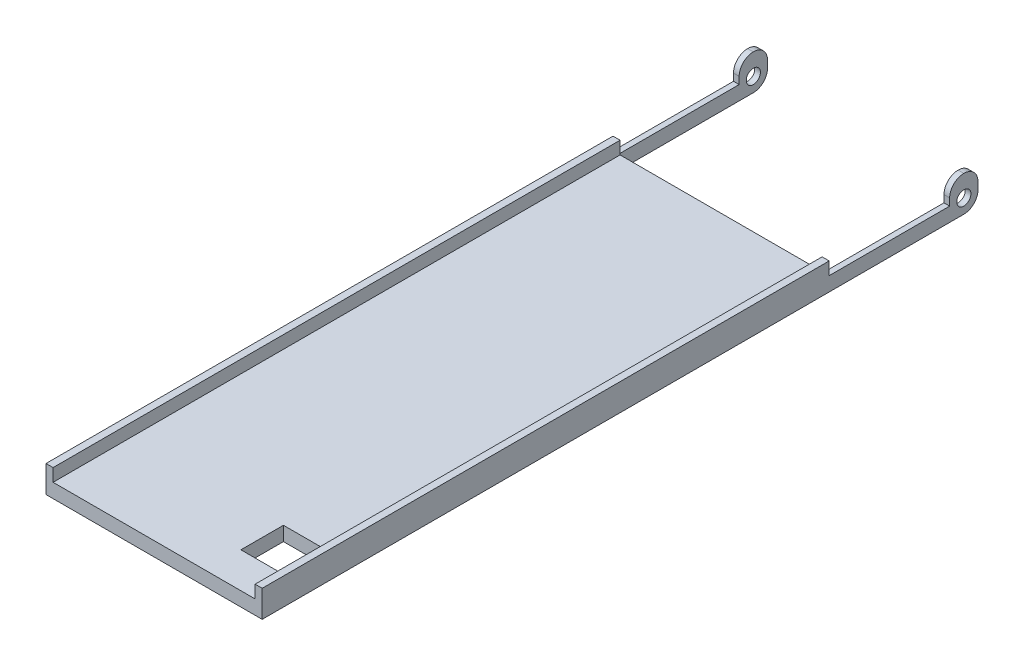
ISO-10303-21;
HEADER;
FILE_DESCRIPTION(('STEP AP214'),'2;1');
FILE_NAME('part.step','',(''),(''),'','','');
FILE_SCHEMA(('AUTOMOTIVE_DESIGN { 1 0 10303 214 1 1 1 1 }'));
ENDSEC;
DATA;
#1=APPLICATION_CONTEXT('core data for automotive mechanical design processes');
#2=APPLICATION_PROTOCOL_DEFINITION('international standard','automotive_design',2000,#1);
#3=PRODUCT_CONTEXT('',#1,'mechanical');
#4=PRODUCT('Part','Part','',(#3));
#5=PRODUCT_RELATED_PRODUCT_CATEGORY('part','',(#4));
#6=PRODUCT_DEFINITION_FORMATION('','',#4);
#7=PRODUCT_DEFINITION_CONTEXT('part definition',#1,'design');
#8=PRODUCT_DEFINITION('design','',#6,#7);
#9=PRODUCT_DEFINITION_SHAPE('','',#8);
#10=(LENGTH_UNIT() NAMED_UNIT(*) SI_UNIT(.MILLI.,.METRE.));
#11=(NAMED_UNIT(*) PLANE_ANGLE_UNIT() SI_UNIT($,.RADIAN.));
#12=(NAMED_UNIT(*) SI_UNIT($,.STERADIAN.) SOLID_ANGLE_UNIT());
#13=UNCERTAINTY_MEASURE_WITH_UNIT(LENGTH_MEASURE(1.E-05),#10,'distance_accuracy_value','');
#14=(GEOMETRIC_REPRESENTATION_CONTEXT(3) GLOBAL_UNCERTAINTY_ASSIGNED_CONTEXT((#13)) GLOBAL_UNIT_ASSIGNED_CONTEXT((#10,
#11,#12)) REPRESENTATION_CONTEXT('',''));
#15=CARTESIAN_POINT('',(0.,0.,0.));
#16=DIRECTION('',(0.,0.,1.));
#17=DIRECTION('',(1.,0.,0.));
#18=AXIS2_PLACEMENT_3D('',#15,#16,#17);
#19=CARTESIAN_POINT('',(0.,2.,0.));
#20=DIRECTION('',(0.,1.,0.));
#21=DIRECTION('',(0.,0.,1.));
#22=AXIS2_PLACEMENT_3D('',#19,#20,#21);
#23=PLANE('',#22);
#24=DIRECTION('',(0.,0.,-1.));
#25=VECTOR('',#24,1.);
#26=CARTESIAN_POINT('',(14.45,2.,-42.5));
#27=LINE('',#26,#25);
#28=CARTESIAN_POINT('',(14.45,2.,-21.5));
#29=VERTEX_POINT('',#28);
#30=CARTESIAN_POINT('',(14.45,2.,-38.5));
#31=VERTEX_POINT('',#30);
#32=EDGE_CURVE('E397',#29,#31,#27,.T.);
#33=ORIENTED_EDGE('',*,*,#32,.F.);
#34=DIRECTION('',(-1.,0.,0.));
#35=VECTOR('',#34,1.);
#36=CARTESIAN_POINT('',(15.25,2.,-21.5));
#37=LINE('',#36,#35);
#38=CARTESIAN_POINT('',(15.25,2.,-21.5));
#39=VERTEX_POINT('',#38);
#40=EDGE_CURVE('E322',#39,#29,#37,.T.);
#41=ORIENTED_EDGE('',*,*,#40,.F.);
#42=DIRECTION('',(0.,0.,-1.));
#43=VECTOR('',#42,1.);
#44=CARTESIAN_POINT('',(15.25,2.,42.5));
#45=LINE('',#44,#43);
#46=CARTESIAN_POINT('',(15.25,2.,-38.5));
#47=VERTEX_POINT('',#46);
#48=EDGE_CURVE('E420',#39,#47,#45,.T.);
#49=ORIENTED_EDGE('',*,*,#48,.T.);
#50=DIRECTION('',(1.,0.,0.));
#51=VECTOR('',#50,1.);
#52=CARTESIAN_POINT('',(14.45,2.,-38.5));
#53=LINE('',#52,#51);
#54=EDGE_CURVE('E362',#31,#47,#53,.T.);
#55=ORIENTED_EDGE('',*,*,#54,.F.);
#56=EDGE_LOOP('',(#33,#41,#49,#55));
#57=FACE_BOUND('',#56,.T.);
#58=ADVANCED_FACE('F45',(#57),#23,.T.);
#59=DIRECTION('',(1.,0.,0.));
#60=VECTOR('',#59,1.);
#61=CARTESIAN_POINT('',(14.25,2.,53.5));
#62=LINE('',#61,#60);
#63=CARTESIAN_POINT('',(7.25000000000001,2.,53.5));
#64=VERTEX_POINT('',#63);
#65=CARTESIAN_POINT('',(14.25,2.,53.5));
#66=VERTEX_POINT('',#65);
#67=EDGE_CURVE('E70',#64,#66,#62,.T.);
#68=ORIENTED_EDGE('',*,*,#67,.F.);
#69=DIRECTION('',(0.,0.,1.));
#70=VECTOR('',#69,1.);
#71=CARTESIAN_POINT('',(7.25000000000001,2.,47.5));
#72=LINE('',#71,#70);
#73=CARTESIAN_POINT('',(7.25000000000001,2.,47.5));
#74=VERTEX_POINT('',#73);
#75=EDGE_CURVE('E247',#74,#64,#72,.T.);
#76=ORIENTED_EDGE('',*,*,#75,.F.);
#77=DIRECTION('',(-1.,0.,0.));
#78=VECTOR('',#77,1.);
#79=CARTESIAN_POINT('',(14.25,2.,47.5));
#80=LINE('',#79,#78);
#81=CARTESIAN_POINT('',(14.25,2.,47.5));
#82=VERTEX_POINT('',#81);
#83=EDGE_CURVE('E254',#82,#74,#80,.T.);
#84=ORIENTED_EDGE('',*,*,#83,.F.);
#85=DIRECTION('',(0.,0.,-1.));
#86=VECTOR('',#85,1.);
#87=CARTESIAN_POINT('',(14.25,2.,-21.5));
#88=LINE('',#87,#86);
#89=CARTESIAN_POINT('',(14.25,2.,-21.5));
#90=VERTEX_POINT('',#89);
#91=EDGE_CURVE('E227',#82,#90,#88,.T.);
#92=ORIENTED_EDGE('',*,*,#91,.T.);
#93=DIRECTION('',(1.,0.,0.));
#94=VECTOR('',#93,1.);
#95=CARTESIAN_POINT('',(14.45,2.,-21.5));
#96=LINE('',#95,#94);
#97=CARTESIAN_POINT('',(-14.25,2.,-21.5));
#98=VERTEX_POINT('',#97);
#99=EDGE_CURVE('E280',#98,#90,#96,.T.);
#100=ORIENTED_EDGE('',*,*,#99,.F.);
#101=DIRECTION('',(0.,0.,1.));
#102=VECTOR('',#101,1.);
#103=CARTESIAN_POINT('',(-14.25,2.,-21.5));
#104=LINE('',#103,#102);
#105=CARTESIAN_POINT('',(-14.25,2.,58.5));
#106=VERTEX_POINT('',#105);
#107=EDGE_CURVE('E285',#98,#106,#104,.T.);
#108=ORIENTED_EDGE('',*,*,#107,.T.);
#109=DIRECTION('',(1.,0.,0.));
#110=VECTOR('',#109,1.);
#111=CARTESIAN_POINT('',(-14.25,2.,58.5));
#112=LINE('',#111,#110);
#113=CARTESIAN_POINT('',(14.25,2.,58.5));
#114=VERTEX_POINT('',#113);
#115=EDGE_CURVE('E289',#106,#114,#112,.T.);
#116=ORIENTED_EDGE('',*,*,#115,.T.);
#117=EDGE_CURVE('E294',#114,#66,#88,.T.);
#118=ORIENTED_EDGE('',*,*,#117,.T.);
#119=EDGE_LOOP('',(#68,#76,#84,#92,#100,#108,#116,#118));
#120=FACE_BOUND('',#119,.T.);
#121=ADVANCED_FACE('F591',(#120),#23,.T.);
#122=CARTESIAN_POINT('',(0.,3.8,0.));
#123=DIRECTION('',(0.,1.,0.));
#124=DIRECTION('',(0.,0.,1.));
#125=AXIS2_PLACEMENT_3D('',#122,#123,#124);
#126=PLANE('',#125);
#127=DIRECTION('',(0.,0.,1.));
#128=VECTOR('',#127,1.);
#129=CARTESIAN_POINT('',(-14.25,3.8,-21.5));
#130=LINE('',#129,#128);
#131=CARTESIAN_POINT('',(-14.25,3.8,-21.5));
#132=VERTEX_POINT('',#131);
#133=CARTESIAN_POINT('',(-14.25,3.8,58.5));
#134=VERTEX_POINT('',#133);
#135=EDGE_CURVE('E284',#132,#134,#130,.T.);
#136=ORIENTED_EDGE('',*,*,#135,.F.);
#137=DIRECTION('',(-1.,0.,0.));
#138=VECTOR('',#137,1.);
#139=CARTESIAN_POINT('',(15.25,3.8,-21.5));
#140=LINE('',#139,#138);
#141=CARTESIAN_POINT('',(-15.25,3.8,-21.5));
#142=VERTEX_POINT('',#141);
#143=EDGE_CURVE('E321',#132,#142,#140,.T.);
#144=ORIENTED_EDGE('',*,*,#143,.T.);
#145=DIRECTION('',(0.,0.,1.));
#146=VECTOR('',#145,1.);
#147=CARTESIAN_POINT('',(-15.25,3.8,58.5));
#148=LINE('',#147,#146);
#149=CARTESIAN_POINT('',(-15.25,3.8,58.5));
#150=VERTEX_POINT('',#149);
#151=EDGE_CURVE('E327',#142,#150,#148,.T.);
#152=ORIENTED_EDGE('',*,*,#151,.T.);
#153=DIRECTION('',(1.,0.,0.));
#154=VECTOR('',#153,1.);
#155=CARTESIAN_POINT('',(15.25,3.8,58.5));
#156=LINE('',#155,#154);
#157=EDGE_CURVE('E332',#150,#134,#156,.T.);
#158=ORIENTED_EDGE('',*,*,#157,.T.);
#159=EDGE_LOOP('',(#136,#144,#152,#158));
#160=FACE_BOUND('',#159,.T.);
#161=ADVANCED_FACE('F600',(#160),#126,.T.);
#162=CARTESIAN_POINT('',(-14.45,2.,-21.5));
#163=VERTEX_POINT('',#162);
#164=CARTESIAN_POINT('',(-15.25,2.,-21.5));
#165=VERTEX_POINT('',#164);
#166=EDGE_CURVE('E306',#163,#165,#37,.T.);
#167=ORIENTED_EDGE('',*,*,#166,.F.);
#168=DIRECTION('',(0.,0.,1.));
#169=VECTOR('',#168,1.);
#170=CARTESIAN_POINT('',(-14.45,2.,-24.5));
#171=LINE('',#170,#169);
#172=CARTESIAN_POINT('',(-14.45,2.,-38.5));
#173=VERTEX_POINT('',#172);
#174=EDGE_CURVE('E403',#173,#163,#171,.T.);
#175=ORIENTED_EDGE('',*,*,#174,.F.);
#176=DIRECTION('',(-1.,0.,0.));
#177=VECTOR('',#176,1.);
#178=CARTESIAN_POINT('',(-14.45,2.,-38.5));
#179=LINE('',#178,#177);
#180=CARTESIAN_POINT('',(-15.25,2.,-38.5));
#181=VERTEX_POINT('',#180);
#182=EDGE_CURVE('E383',#173,#181,#179,.T.);
#183=ORIENTED_EDGE('',*,*,#182,.T.);
#184=DIRECTION('',(0.,0.,-1.));
#185=VECTOR('',#184,1.);
#186=CARTESIAN_POINT('',(-15.25,2.,42.5));
#187=LINE('',#186,#185);
#188=EDGE_CURVE('E423',#165,#181,#187,.T.);
#189=ORIENTED_EDGE('',*,*,#188,.F.);
#190=EDGE_LOOP('',(#167,#175,#183,#189));
#191=FACE_BOUND('',#190,.T.);
#192=ADVANCED_FACE('F585',(#191),#23,.T.);
#193=CARTESIAN_POINT('',(-15.25,2.,-42.5));
#194=DIRECTION('',(0.,0.,-1.));
#195=DIRECTION('',(-1.,0.,0.));
#196=AXIS2_PLACEMENT_3D('',#193,#194,#195);
#197=PLANE('',#196);
#198=DIRECTION('',(0.,1.,0.));
#199=VECTOR('',#198,1.);
#200=CARTESIAN_POINT('',(-14.45,0.,-42.5));
#201=LINE('',#200,#199);
#202=CARTESIAN_POINT('',(-14.45,2.,-42.5));
#203=VERTEX_POINT('',#202);
#204=CARTESIAN_POINT('',(-14.45,3.,-42.5));
#205=VERTEX_POINT('',#204);
#206=EDGE_CURVE('E412',#203,#205,#201,.T.);
#207=ORIENTED_EDGE('',*,*,#206,.F.);
#208=DIRECTION('',(1.,0.,0.));
#209=VECTOR('',#208,1.);
#210=CARTESIAN_POINT('',(-15.25,2.,-42.5));
#211=LINE('',#210,#209);
#212=CARTESIAN_POINT('',(-15.25,2.,-42.5));
#213=VERTEX_POINT('',#212);
#214=EDGE_CURVE('E458',#203,#213,#211,.F.);
#215=ORIENTED_EDGE('',*,*,#214,.T.);
#216=DIRECTION('',(0.,-1.,0.));
#217=VECTOR('',#216,1.);
#218=CARTESIAN_POINT('',(-15.25,2.,-42.5));
#219=LINE('',#218,#217);
#220=CARTESIAN_POINT('',(-15.25,3.,-42.5));
#221=VERTEX_POINT('',#220);
#222=EDGE_CURVE('E427',#221,#213,#219,.T.);
#223=ORIENTED_EDGE('',*,*,#222,.F.);
#224=DIRECTION('',(-1.,0.,0.));
#225=VECTOR('',#224,1.);
#226=CARTESIAN_POINT('',(-15.25,3.,-42.5));
#227=LINE('',#226,#225);
#228=EDGE_CURVE('E454',#221,#205,#227,.F.);
#229=ORIENTED_EDGE('',*,*,#228,.T.);
#230=EDGE_LOOP('',(#207,#215,#223,#229));
#231=FACE_BOUND('',#230,.T.);
#232=ADVANCED_FACE('F562',(#231),#197,.T.);
#233=CARTESIAN_POINT('',(15.25,2.,42.5));
#234=DIRECTION('',(-1.,0.,0.));
#235=DIRECTION('',(0.,0.,1.));
#236=AXIS2_PLACEMENT_3D('',#233,#234,#235);
#237=PLANE('',#236);
#238=CARTESIAN_POINT('',(15.25,2.,-40.5));
#239=DIRECTION('',(-1.,0.,0.));
#240=DIRECTION('',(0.,0.,1.));
#241=AXIS2_PLACEMENT_3D('',#238,#239,#240);
#242=CIRCLE('',#241,0.999999999999998);
#243=CARTESIAN_POINT('',(15.25,2.,-39.5));
#244=VERTEX_POINT('',#243);
#245=EDGE_CURVE('E363',#244,#244,#242,.T.);
#246=ORIENTED_EDGE('',*,*,#245,.T.);
#247=EDGE_LOOP('',(#246));
#248=FACE_BOUND('',#247,.T.);
#249=DIRECTION('',(0.,0.,-1.));
#250=VECTOR('',#249,1.);
#251=CARTESIAN_POINT('',(15.25,0.,42.5));
#252=LINE('',#251,#250);
#253=CARTESIAN_POINT('',(15.25,0.,58.5));
#254=VERTEX_POINT('',#253);
#255=CARTESIAN_POINT('',(15.25,0.,-40.5));
#256=VERTEX_POINT('',#255);
#257=EDGE_CURVE('E416',#254,#256,#252,.T.);
#258=ORIENTED_EDGE('',*,*,#257,.T.);
#259=CARTESIAN_POINT('',(15.25,2.,-40.5));
#260=DIRECTION('',(-1.,0.,0.));
#261=DIRECTION('',(0.,0.,1.));
#262=AXIS2_PLACEMENT_3D('',#259,#260,#261);
#263=CIRCLE('',#262,2.);
#264=CARTESIAN_POINT('',(15.25,2.,-42.5));
#265=VERTEX_POINT('',#264);
#266=EDGE_CURVE('E486',#256,#265,#263,.F.);
#267=ORIENTED_EDGE('',*,*,#266,.T.);
#268=DIRECTION('',(0.,-1.,0.));
#269=VECTOR('',#268,1.);
#270=CARTESIAN_POINT('',(15.25,2.,-42.5));
#271=LINE('',#270,#269);
#272=CARTESIAN_POINT('',(15.25,3.,-42.5));
#273=VERTEX_POINT('',#272);
#274=EDGE_CURVE('E437',#273,#265,#271,.T.);
#275=ORIENTED_EDGE('',*,*,#274,.F.);
#276=CARTESIAN_POINT('',(15.25,3.,-40.5));
#277=DIRECTION('',(-1.,0.,0.));
#278=DIRECTION('',(0.,0.,1.));
#279=AXIS2_PLACEMENT_3D('',#276,#277,#278);
#280=CIRCLE('',#279,2.);
#281=CARTESIAN_POINT('',(15.25,5.,-40.5));
#282=VERTEX_POINT('',#281);
#283=EDGE_CURVE('E480',#273,#282,#280,.F.);
#284=ORIENTED_EDGE('',*,*,#283,.T.);
#285=CARTESIAN_POINT('',(15.25,3.,-40.5));
#286=DIRECTION('',(-1.,0.,0.));
#287=DIRECTION('',(0.,0.,1.));
#288=AXIS2_PLACEMENT_3D('',#285,#286,#287);
#289=CIRCLE('',#288,2.);
#290=CARTESIAN_POINT('',(15.25,3.,-38.5));
#291=VERTEX_POINT('',#290);
#292=EDGE_CURVE('E483',#282,#291,#289,.F.);
#293=ORIENTED_EDGE('',*,*,#292,.T.);
#294=DIRECTION('',(0.,-1.,0.));
#295=VECTOR('',#294,1.);
#296=CARTESIAN_POINT('',(15.25,5.,-38.5));
#297=LINE('',#296,#295);
#298=EDGE_CURVE('E371',#291,#47,#297,.T.);
#299=ORIENTED_EDGE('',*,*,#298,.T.);
#300=ORIENTED_EDGE('',*,*,#48,.F.);
#301=DIRECTION('',(0.,-1.,0.));
#302=VECTOR('',#301,1.);
#303=CARTESIAN_POINT('',(15.25,3.8,-21.5));
#304=LINE('',#303,#302);
#305=CARTESIAN_POINT('',(15.25,3.8,-21.5));
#306=VERTEX_POINT('',#305);
#307=EDGE_CURVE('E343',#306,#39,#304,.T.);
#308=ORIENTED_EDGE('',*,*,#307,.F.);
#309=DIRECTION('',(0.,0.,-1.));
#310=VECTOR('',#309,1.);
#311=CARTESIAN_POINT('',(15.25,3.8,58.5));
#312=LINE('',#311,#310);
#313=CARTESIAN_POINT('',(15.25,3.8,58.5));
#314=VERTEX_POINT('',#313);
#315=EDGE_CURVE('E317',#314,#306,#312,.T.);
#316=ORIENTED_EDGE('',*,*,#315,.F.);
#317=DIRECTION('',(0.,1.,0.));
#318=VECTOR('',#317,1.);
#319=CARTESIAN_POINT('',(15.25,2.,58.5));
#320=LINE('',#319,#318);
#321=EDGE_CURVE('E354',#254,#314,#320,.T.);
#322=ORIENTED_EDGE('',*,*,#321,.F.);
#323=EDGE_LOOP('',(#258,#267,#275,#284,#293,#299,#300,#308,#316,#322));
#324=FACE_BOUND('',#323,.T.);
#325=ADVANCED_FACE('F514',(#248,#324),#237,.F.);
#326=ORIENTED_EDGE('',*,*,#274,.T.);
#327=DIRECTION('',(1.,0.,0.));
#328=VECTOR('',#327,1.);
#329=CARTESIAN_POINT('',(14.45,2.,-42.5));
#330=LINE('',#329,#328);
#331=CARTESIAN_POINT('',(14.45,2.,-42.5));
#332=VERTEX_POINT('',#331);
#333=EDGE_CURVE('E492',#265,#332,#330,.F.);
#334=ORIENTED_EDGE('',*,*,#333,.T.);
#335=DIRECTION('',(0.,1.,0.));
#336=VECTOR('',#335,1.);
#337=CARTESIAN_POINT('',(14.45,0.,-42.5));
#338=LINE('',#337,#336);
#339=CARTESIAN_POINT('',(14.45,3.,-42.5));
#340=VERTEX_POINT('',#339);
#341=EDGE_CURVE('E406',#332,#340,#338,.T.);
#342=ORIENTED_EDGE('',*,*,#341,.T.);
#343=DIRECTION('',(1.,0.,0.));
#344=VECTOR('',#343,1.);
#345=CARTESIAN_POINT('',(-15.25,3.,-42.5));
#346=LINE('',#345,#344);
#347=EDGE_CURVE('E489',#340,#273,#346,.T.);
#348=ORIENTED_EDGE('',*,*,#347,.T.);
#349=EDGE_LOOP('',(#326,#334,#342,#348));
#350=FACE_BOUND('',#349,.T.);
#351=ADVANCED_FACE('F518',(#350),#197,.T.);
#352=CARTESIAN_POINT('',(-15.25,2.,42.5));
#353=DIRECTION('',(-1.,0.,0.));
#354=DIRECTION('',(0.,0.,1.));
#355=AXIS2_PLACEMENT_3D('',#352,#353,#354);
#356=PLANE('',#355);
#357=CARTESIAN_POINT('',(-15.25,2.,-40.5));
#358=DIRECTION('',(-1.,0.,0.));
#359=DIRECTION('',(0.,0.,1.));
#360=AXIS2_PLACEMENT_3D('',#357,#358,#359);
#361=CIRCLE('',#360,0.999999999999998);
#362=CARTESIAN_POINT('',(-15.25,2.,-39.5));
#363=VERTEX_POINT('',#362);
#364=EDGE_CURVE('E378',#363,#363,#361,.T.);
#365=ORIENTED_EDGE('',*,*,#364,.F.);
#366=EDGE_LOOP('',(#365));
#367=FACE_BOUND('',#366,.T.);
#368=ORIENTED_EDGE('',*,*,#222,.T.);
#369=CARTESIAN_POINT('',(-15.25,2.,-40.5));
#370=DIRECTION('',(-1.,0.,0.));
#371=DIRECTION('',(0.,0.,1.));
#372=AXIS2_PLACEMENT_3D('',#369,#370,#371);
#373=CIRCLE('',#372,2.);
#374=CARTESIAN_POINT('',(-15.25,0.,-40.5));
#375=VERTEX_POINT('',#374);
#376=EDGE_CURVE('E467',#213,#375,#373,.T.);
#377=ORIENTED_EDGE('',*,*,#376,.T.);
#378=DIRECTION('',(0.,0.,-1.));
#379=VECTOR('',#378,1.);
#380=CARTESIAN_POINT('',(-15.25,0.,42.5));
#381=LINE('',#380,#379);
#382=CARTESIAN_POINT('',(-15.25,0.,58.5));
#383=VERTEX_POINT('',#382);
#384=EDGE_CURVE('E424',#383,#375,#381,.T.);
#385=ORIENTED_EDGE('',*,*,#384,.F.);
#386=DIRECTION('',(0.,-1.,0.));
#387=VECTOR('',#386,1.);
#388=CARTESIAN_POINT('',(-15.25,2.,58.5));
#389=LINE('',#388,#387);
#390=EDGE_CURVE('E346',#150,#383,#389,.T.);
#391=ORIENTED_EDGE('',*,*,#390,.F.);
#392=ORIENTED_EDGE('',*,*,#151,.F.);
#393=DIRECTION('',(0.,-1.,0.));
#394=VECTOR('',#393,1.);
#395=CARTESIAN_POINT('',(-15.25,3.8,-21.5));
#396=LINE('',#395,#394);
#397=EDGE_CURVE('E336',#142,#165,#396,.T.);
#398=ORIENTED_EDGE('',*,*,#397,.T.);
#399=ORIENTED_EDGE('',*,*,#188,.T.);
#400=DIRECTION('',(0.,-1.,0.));
#401=VECTOR('',#400,1.);
#402=CARTESIAN_POINT('',(-15.25,5.,-38.5));
#403=LINE('',#402,#401);
#404=CARTESIAN_POINT('',(-15.25,3.,-38.5));
#405=VERTEX_POINT('',#404);
#406=EDGE_CURVE('E393',#405,#181,#403,.T.);
#407=ORIENTED_EDGE('',*,*,#406,.F.);
#408=CARTESIAN_POINT('',(-15.25,3.,-40.5));
#409=DIRECTION('',(-1.,0.,0.));
#410=DIRECTION('',(0.,0.,1.));
#411=AXIS2_PLACEMENT_3D('',#408,#409,#410);
#412=CIRCLE('',#411,2.);
#413=CARTESIAN_POINT('',(-15.25,5.,-40.5));
#414=VERTEX_POINT('',#413);
#415=EDGE_CURVE('E461',#405,#414,#412,.T.);
#416=ORIENTED_EDGE('',*,*,#415,.T.);
#417=CARTESIAN_POINT('',(-15.25,3.,-40.5));
#418=DIRECTION('',(-1.,0.,0.));
#419=DIRECTION('',(0.,0.,1.));
#420=AXIS2_PLACEMENT_3D('',#417,#418,#419);
#421=CIRCLE('',#420,2.);
#422=EDGE_CURVE('E464',#414,#221,#421,.T.);
#423=ORIENTED_EDGE('',*,*,#422,.T.);
#424=EDGE_LOOP('',(#368,#377,#385,#391,#392,#398,#399,#407,#416,#423));
#425=FACE_BOUND('',#424,.T.);
#426=ADVANCED_FACE('F579',(#367,#425),#356,.T.);
#427=CARTESIAN_POINT('',(0.,0.,0.));
#428=DIRECTION('',(0.,1.,0.));
#429=DIRECTION('',(0.,0.,1.));
#430=AXIS2_PLACEMENT_3D('',#427,#428,#429);
#431=PLANE('',#430);
#432=DIRECTION('',(1.,0.,0.));
#433=VECTOR('',#432,1.);
#434=CARTESIAN_POINT('',(14.25,0.,53.5));
#435=LINE('',#434,#433);
#436=CARTESIAN_POINT('',(7.25000000000001,0.,53.5));
#437=VERTEX_POINT('',#436);
#438=CARTESIAN_POINT('',(14.25,0.,53.5));
#439=VERTEX_POINT('',#438);
#440=EDGE_CURVE('E233',#437,#439,#435,.T.);
#441=ORIENTED_EDGE('',*,*,#440,.T.);
#442=DIRECTION('',(0.,0.,-1.));
#443=VECTOR('',#442,1.);
#444=CARTESIAN_POINT('',(14.25,0.,47.5));
#445=LINE('',#444,#443);
#446=CARTESIAN_POINT('',(14.25,0.,47.5));
#447=VERTEX_POINT('',#446);
#448=EDGE_CURVE('E224',#439,#447,#445,.T.);
#449=ORIENTED_EDGE('',*,*,#448,.T.);
#450=DIRECTION('',(-1.,0.,0.));
#451=VECTOR('',#450,1.);
#452=CARTESIAN_POINT('',(14.25,0.,47.5));
#453=LINE('',#452,#451);
#454=CARTESIAN_POINT('',(7.25000000000001,0.,47.5));
#455=VERTEX_POINT('',#454);
#456=EDGE_CURVE('E236',#447,#455,#453,.T.);
#457=ORIENTED_EDGE('',*,*,#456,.T.);
#458=DIRECTION('',(0.,0.,1.));
#459=VECTOR('',#458,1.);
#460=CARTESIAN_POINT('',(7.25000000000001,0.,47.5));
#461=LINE('',#460,#459);
#462=EDGE_CURVE('E62',#455,#437,#461,.T.);
#463=ORIENTED_EDGE('',*,*,#462,.T.);
#464=EDGE_LOOP('',(#441,#449,#457,#463));
#465=FACE_BOUND('',#464,.T.);
#466=DIRECTION('',(-1.,0.,0.));
#467=VECTOR('',#466,1.);
#468=CARTESIAN_POINT('',(14.45,0.,-21.5));
#469=LINE('',#468,#467);
#470=CARTESIAN_POINT('',(14.45,0.,-21.5));
#471=VERTEX_POINT('',#470);
#472=CARTESIAN_POINT('',(-14.45,0.,-21.5));
#473=VERTEX_POINT('',#472);
#474=EDGE_CURVE('E272',#471,#473,#469,.T.);
#475=ORIENTED_EDGE('',*,*,#474,.F.);
#476=DIRECTION('',(0.,0.,-1.));
#477=VECTOR('',#476,1.);
#478=CARTESIAN_POINT('',(14.45,0.,-24.5));
#479=LINE('',#478,#477);
#480=CARTESIAN_POINT('',(14.45,0.,-40.5));
#481=VERTEX_POINT('',#480);
#482=EDGE_CURVE('E398',#471,#481,#479,.T.);
#483=ORIENTED_EDGE('',*,*,#482,.T.);
#484=DIRECTION('',(1.,0.,0.));
#485=VECTOR('',#484,1.);
#486=CARTESIAN_POINT('',(15.25,0.,-40.5));
#487=LINE('',#486,#485);
#488=EDGE_CURVE('E473',#481,#256,#487,.T.);
#489=ORIENTED_EDGE('',*,*,#488,.T.);
#490=ORIENTED_EDGE('',*,*,#257,.F.);
#491=DIRECTION('',(1.,0.,0.));
#492=VECTOR('',#491,1.);
#493=CARTESIAN_POINT('',(-15.25,0.,58.5));
#494=LINE('',#493,#492);
#495=EDGE_CURVE('E350',#383,#254,#494,.T.);
#496=ORIENTED_EDGE('',*,*,#495,.F.);
#497=ORIENTED_EDGE('',*,*,#384,.T.);
#498=DIRECTION('',(1.,0.,0.));
#499=VECTOR('',#498,1.);
#500=CARTESIAN_POINT('',(-14.45,0.,-40.5));
#501=LINE('',#500,#499);
#502=CARTESIAN_POINT('',(-14.45,0.,-40.5));
#503=VERTEX_POINT('',#502);
#504=EDGE_CURVE('E441',#375,#503,#501,.T.);
#505=ORIENTED_EDGE('',*,*,#504,.T.);
#506=DIRECTION('',(0.,0.,1.));
#507=VECTOR('',#506,1.);
#508=CARTESIAN_POINT('',(-14.45,0.,-42.5));
#509=LINE('',#508,#507);
#510=EDGE_CURVE('E402',#503,#473,#509,.T.);
#511=ORIENTED_EDGE('',*,*,#510,.T.);
#512=EDGE_LOOP('',(#475,#483,#489,#490,#496,#497,#505,#511));
#513=FACE_BOUND('',#512,.T.);
#514=ADVANCED_FACE('F241',(#465,#513),#431,.F.);
#515=CARTESIAN_POINT('',(-14.45,0.,-24.5));
#516=DIRECTION('',(-1.,0.,0.));
#517=DIRECTION('',(0.,0.,1.));
#518=AXIS2_PLACEMENT_3D('',#515,#516,#517);
#519=PLANE('',#518);
#520=CARTESIAN_POINT('',(-14.45,2.,-40.5));
#521=DIRECTION('',(-1.,0.,0.));
#522=DIRECTION('',(0.,0.,1.));
#523=AXIS2_PLACEMENT_3D('',#520,#521,#522);
#524=CIRCLE('',#523,0.999999999999998);
#525=CARTESIAN_POINT('',(-14.45,2.,-39.5));
#526=VERTEX_POINT('',#525);
#527=EDGE_CURVE('E379',#526,#526,#524,.T.);
#528=ORIENTED_EDGE('',*,*,#527,.T.);
#529=EDGE_LOOP('',(#528));
#530=FACE_BOUND('',#529,.T.);
#531=ORIENTED_EDGE('',*,*,#510,.F.);
#532=CARTESIAN_POINT('',(-14.45,2.,-40.5));
#533=DIRECTION('',(-1.,0.,0.));
#534=DIRECTION('',(0.,0.,1.));
#535=AXIS2_PLACEMENT_3D('',#532,#533,#534);
#536=CIRCLE('',#535,2.);
#537=EDGE_CURVE('E451',#503,#203,#536,.F.);
#538=ORIENTED_EDGE('',*,*,#537,.T.);
#539=ORIENTED_EDGE('',*,*,#206,.T.);
#540=CARTESIAN_POINT('',(-14.45,3.,-40.5));
#541=DIRECTION('',(-1.,0.,0.));
#542=DIRECTION('',(0.,0.,1.));
#543=AXIS2_PLACEMENT_3D('',#540,#541,#542);
#544=CIRCLE('',#543,2.);
#545=CARTESIAN_POINT('',(-14.45,5.,-40.5));
#546=VERTEX_POINT('',#545);
#547=EDGE_CURVE('E448',#205,#546,#544,.F.);
#548=ORIENTED_EDGE('',*,*,#547,.T.);
#549=CARTESIAN_POINT('',(-14.45,3.,-40.5));
#550=DIRECTION('',(-1.,0.,0.));
#551=DIRECTION('',(0.,0.,1.));
#552=AXIS2_PLACEMENT_3D('',#549,#550,#551);
#553=CIRCLE('',#552,2.);
#554=CARTESIAN_POINT('',(-14.45,3.,-38.5));
#555=VERTEX_POINT('',#554);
#556=EDGE_CURVE('E445',#546,#555,#553,.F.);
#557=ORIENTED_EDGE('',*,*,#556,.T.);
#558=DIRECTION('',(0.,-1.,0.));
#559=VECTOR('',#558,1.);
#560=CARTESIAN_POINT('',(-14.45,5.,-38.5));
#561=LINE('',#560,#559);
#562=EDGE_CURVE('E390',#555,#173,#561,.T.);
#563=ORIENTED_EDGE('',*,*,#562,.T.);
#564=ORIENTED_EDGE('',*,*,#174,.T.);
#565=DIRECTION('',(0.,1.,0.));
#566=VECTOR('',#565,1.);
#567=CARTESIAN_POINT('',(-14.45,2.,-21.5));
#568=LINE('',#567,#566);
#569=EDGE_CURVE('E276',#473,#163,#568,.T.);
#570=ORIENTED_EDGE('',*,*,#569,.F.);
#571=EDGE_LOOP('',(#531,#538,#539,#548,#557,#563,#564,#570));
#572=FACE_BOUND('',#571,.T.);
#573=ADVANCED_FACE('F559',(#530,#572),#519,.F.);
#574=CARTESIAN_POINT('',(14.45,0.,-42.5));
#575=DIRECTION('',(1.,0.,0.));
#576=DIRECTION('',(0.,0.,-1.));
#577=AXIS2_PLACEMENT_3D('',#574,#575,#576);
#578=PLANE('',#577);
#579=CARTESIAN_POINT('',(14.45,2.,-40.5));
#580=DIRECTION('',(-1.,0.,0.));
#581=DIRECTION('',(0.,0.,1.));
#582=AXIS2_PLACEMENT_3D('',#579,#580,#581);
#583=CIRCLE('',#582,0.999999999999998);
#584=CARTESIAN_POINT('',(14.45,2.,-39.5));
#585=VERTEX_POINT('',#584);
#586=EDGE_CURVE('E358',#585,#585,#583,.T.);
#587=ORIENTED_EDGE('',*,*,#586,.F.);
#588=EDGE_LOOP('',(#587));
#589=FACE_BOUND('',#588,.T.);
#590=ORIENTED_EDGE('',*,*,#341,.F.);
#591=CARTESIAN_POINT('',(14.45,2.,-40.5));
#592=DIRECTION('',(1.,0.,0.));
#593=DIRECTION('',(0.,0.,-1.));
#594=AXIS2_PLACEMENT_3D('',#591,#592,#593);
#595=CIRCLE('',#594,2.);
#596=EDGE_CURVE('E55',#332,#481,#595,.F.);
#597=ORIENTED_EDGE('',*,*,#596,.T.);
#598=ORIENTED_EDGE('',*,*,#482,.F.);
#599=DIRECTION('',(0.,-1.,0.));
#600=VECTOR('',#599,1.);
#601=CARTESIAN_POINT('',(14.45,2.,-21.5));
#602=LINE('',#601,#600);
#603=EDGE_CURVE('E263',#29,#471,#602,.T.);
#604=ORIENTED_EDGE('',*,*,#603,.F.);
#605=ORIENTED_EDGE('',*,*,#32,.T.);
#606=DIRECTION('',(0.,-1.,0.));
#607=VECTOR('',#606,1.);
#608=CARTESIAN_POINT('',(14.45,5.,-38.5));
#609=LINE('',#608,#607);
#610=CARTESIAN_POINT('',(14.45,3.,-38.5));
#611=VERTEX_POINT('',#610);
#612=EDGE_CURVE('E375',#611,#31,#609,.T.);
#613=ORIENTED_EDGE('',*,*,#612,.F.);
#614=CARTESIAN_POINT('',(14.45,3.,-40.5));
#615=DIRECTION('',(1.,0.,0.));
#616=DIRECTION('',(0.,0.,-1.));
#617=AXIS2_PLACEMENT_3D('',#614,#615,#616);
#618=CIRCLE('',#617,2.);
#619=CARTESIAN_POINT('',(14.45,5.,-40.5));
#620=VERTEX_POINT('',#619);
#621=EDGE_CURVE('E498',#611,#620,#618,.F.);
#622=ORIENTED_EDGE('',*,*,#621,.T.);
#623=CARTESIAN_POINT('',(14.45,3.,-40.5));
#624=DIRECTION('',(1.,0.,0.));
#625=DIRECTION('',(0.,0.,-1.));
#626=AXIS2_PLACEMENT_3D('',#623,#624,#625);
#627=CIRCLE('',#626,2.);
#628=EDGE_CURVE('E495',#620,#340,#627,.F.);
#629=ORIENTED_EDGE('',*,*,#628,.T.);
#630=EDGE_LOOP('',(#590,#597,#598,#604,#605,#613,#622,#629));
#631=FACE_BOUND('',#630,.T.);
#632=ADVANCED_FACE('F505',(#589,#631),#578,.F.);
#633=CARTESIAN_POINT('',(-14.45,5.,-38.5));
#634=DIRECTION('',(0.,0.,1.));
#635=DIRECTION('',(1.,0.,0.));
#636=AXIS2_PLACEMENT_3D('',#633,#634,#635);
#637=PLANE('',#636);
#638=ORIENTED_EDGE('',*,*,#562,.F.);
#639=DIRECTION('',(-1.,0.,0.));
#640=VECTOR('',#639,1.);
#641=CARTESIAN_POINT('',(-14.45,3.,-38.5));
#642=LINE('',#641,#640);
#643=EDGE_CURVE('E470',#555,#405,#642,.T.);
#644=ORIENTED_EDGE('',*,*,#643,.T.);
#645=ORIENTED_EDGE('',*,*,#406,.T.);
#646=ORIENTED_EDGE('',*,*,#182,.F.);
#647=EDGE_LOOP('',(#638,#644,#645,#646));
#648=FACE_BOUND('',#647,.T.);
#649=ADVANCED_FACE('F577',(#648),#637,.T.);
#650=CARTESIAN_POINT('',(-14.45,2.,-40.5));
#651=DIRECTION('',(-1.,0.,0.));
#652=DIRECTION('',(0.,0.,1.));
#653=AXIS2_PLACEMENT_3D('',#650,#651,#652);
#654=CYLINDRICAL_SURFACE('',#653,0.999999999999998);
#655=ORIENTED_EDGE('',*,*,#527,.F.);
#656=EDGE_LOOP('',(#655));
#657=FACE_BOUND('',#656,.T.);
#658=ORIENTED_EDGE('',*,*,#364,.T.);
#659=EDGE_LOOP('',(#658));
#660=FACE_BOUND('',#659,.T.);
#661=ADVANCED_FACE('F657',(#657,#660),#654,.F.);
#662=CARTESIAN_POINT('',(14.45,5.,-38.5));
#663=DIRECTION('',(0.,0.,-1.));
#664=DIRECTION('',(-1.,0.,0.));
#665=AXIS2_PLACEMENT_3D('',#662,#663,#664);
#666=PLANE('',#665);
#667=ORIENTED_EDGE('',*,*,#298,.F.);
#668=DIRECTION('',(1.,0.,0.));
#669=VECTOR('',#668,1.);
#670=CARTESIAN_POINT('',(14.45,3.,-38.5));
#671=LINE('',#670,#669);
#672=EDGE_CURVE('E11',#291,#611,#671,.F.);
#673=ORIENTED_EDGE('',*,*,#672,.T.);
#674=ORIENTED_EDGE('',*,*,#612,.T.);
#675=ORIENTED_EDGE('',*,*,#54,.T.);
#676=EDGE_LOOP('',(#667,#673,#674,#675));
#677=FACE_BOUND('',#676,.T.);
#678=ADVANCED_FACE('F530',(#677),#666,.F.);
#679=CARTESIAN_POINT('',(14.45,2.,-40.5));
#680=DIRECTION('',(1.,0.,0.));
#681=DIRECTION('',(0.,0.,-1.));
#682=AXIS2_PLACEMENT_3D('',#679,#680,#681);
#683=CYLINDRICAL_SURFACE('',#682,0.999999999999998);
#684=ORIENTED_EDGE('',*,*,#586,.T.);
#685=EDGE_LOOP('',(#684));
#686=FACE_BOUND('',#685,.T.);
#687=ORIENTED_EDGE('',*,*,#245,.F.);
#688=EDGE_LOOP('',(#687));
#689=FACE_BOUND('',#688,.T.);
#690=ADVANCED_FACE('F632',(#686,#689),#683,.F.);
#691=CARTESIAN_POINT('',(0.,2.,-40.5));
#692=DIRECTION('',(-1.,0.,0.));
#693=DIRECTION('',(0.,0.,1.));
#694=AXIS2_PLACEMENT_3D('',#691,#692,#693);
#695=CYLINDRICAL_SURFACE('',#694,2.);
#696=ORIENTED_EDGE('',*,*,#376,.F.);
#697=ORIENTED_EDGE('',*,*,#214,.F.);
#698=ORIENTED_EDGE('',*,*,#537,.F.);
#699=ORIENTED_EDGE('',*,*,#504,.F.);
#700=EDGE_LOOP('',(#696,#697,#698,#699));
#701=FACE_BOUND('',#700,.T.);
#702=ADVANCED_FACE('F555',(#701),#695,.T.);
#703=CARTESIAN_POINT('',(-14.45,3.,-40.5));
#704=DIRECTION('',(-1.,0.,0.));
#705=DIRECTION('',(0.,0.,1.));
#706=AXIS2_PLACEMENT_3D('',#703,#704,#705);
#707=CYLINDRICAL_SURFACE('',#706,2.);
#708=ORIENTED_EDGE('',*,*,#643,.F.);
#709=ORIENTED_EDGE('',*,*,#556,.F.);
#710=DIRECTION('',(-1.,0.,0.));
#711=VECTOR('',#710,1.);
#712=CARTESIAN_POINT('',(3.51281503885302E-13,5.,-40.4999999999999));
#713=LINE('',#712,#711);
#714=EDGE_CURVE('E367',#414,#546,#713,.F.);
#715=ORIENTED_EDGE('',*,*,#714,.F.);
#716=ORIENTED_EDGE('',*,*,#415,.F.);
#717=EDGE_LOOP('',(#708,#709,#715,#716));
#718=FACE_BOUND('',#717,.T.);
#719=ADVANCED_FACE('F573',(#718),#707,.T.);
#720=CARTESIAN_POINT('',(0.,3.,-40.5));
#721=DIRECTION('',(-1.,0.,0.));
#722=DIRECTION('',(0.,0.,1.));
#723=AXIS2_PLACEMENT_3D('',#720,#721,#722);
#724=CYLINDRICAL_SURFACE('',#723,2.);
#725=ORIENTED_EDGE('',*,*,#547,.F.);
#726=ORIENTED_EDGE('',*,*,#228,.F.);
#727=ORIENTED_EDGE('',*,*,#422,.F.);
#728=ORIENTED_EDGE('',*,*,#714,.T.);
#729=EDGE_LOOP('',(#725,#726,#727,#728));
#730=FACE_BOUND('',#729,.T.);
#731=ADVANCED_FACE('F567',(#730),#724,.T.);
#732=CARTESIAN_POINT('',(0.,2.,-40.5));
#733=DIRECTION('',(-1.,0.,0.));
#734=DIRECTION('',(0.,0.,1.));
#735=AXIS2_PLACEMENT_3D('',#732,#733,#734);
#736=CYLINDRICAL_SURFACE('',#735,2.);
#737=ORIENTED_EDGE('',*,*,#596,.F.);
#738=ORIENTED_EDGE('',*,*,#333,.F.);
#739=ORIENTED_EDGE('',*,*,#266,.F.);
#740=ORIENTED_EDGE('',*,*,#488,.F.);
#741=EDGE_LOOP('',(#737,#738,#739,#740));
#742=FACE_BOUND('',#741,.T.);
#743=ADVANCED_FACE('F511',(#742),#736,.T.);
#744=CARTESIAN_POINT('',(-15.25,3.,-40.5));
#745=DIRECTION('',(1.,0.,0.));
#746=DIRECTION('',(0.,0.,-1.));
#747=AXIS2_PLACEMENT_3D('',#744,#745,#746);
#748=CYLINDRICAL_SURFACE('',#747,2.);
#749=ORIENTED_EDGE('',*,*,#347,.F.);
#750=ORIENTED_EDGE('',*,*,#628,.F.);
#751=DIRECTION('',(1.,0.,0.));
#752=VECTOR('',#751,1.);
#753=CARTESIAN_POINT('',(0.,5.,-40.5));
#754=LINE('',#753,#752);
#755=EDGE_CURVE('E49',#282,#620,#754,.F.);
#756=ORIENTED_EDGE('',*,*,#755,.F.);
#757=ORIENTED_EDGE('',*,*,#283,.F.);
#758=EDGE_LOOP('',(#749,#750,#756,#757));
#759=FACE_BOUND('',#758,.T.);
#760=ADVANCED_FACE('F47',(#759),#748,.T.);
#761=CARTESIAN_POINT('',(-3.51281503885302E-13,3.,-40.4999999999999));
#762=DIRECTION('',(-1.,0.,0.));
#763=DIRECTION('',(0.,0.,1.));
#764=AXIS2_PLACEMENT_3D('',#761,#762,#763);
#765=CYLINDRICAL_SURFACE('',#764,2.);
#766=ORIENTED_EDGE('',*,*,#621,.F.);
#767=ORIENTED_EDGE('',*,*,#672,.F.);
#768=ORIENTED_EDGE('',*,*,#292,.F.);
#769=ORIENTED_EDGE('',*,*,#755,.T.);
#770=EDGE_LOOP('',(#766,#767,#768,#769));
#771=FACE_BOUND('',#770,.T.);
#772=ADVANCED_FACE('F533',(#771),#765,.T.);
#773=CARTESIAN_POINT('',(0.,0.,58.5));
#774=DIRECTION('',(0.,0.,1.));
#775=DIRECTION('',(1.,0.,0.));
#776=AXIS2_PLACEMENT_3D('',#773,#774,#775);
#777=PLANE('',#776);
#778=DIRECTION('',(0.,1.,0.));
#779=VECTOR('',#778,1.);
#780=CARTESIAN_POINT('',(-14.25,2.,58.5));
#781=LINE('',#780,#779);
#782=EDGE_CURVE('E298',#106,#134,#781,.T.);
#783=ORIENTED_EDGE('',*,*,#782,.T.);
#784=ORIENTED_EDGE('',*,*,#157,.F.);
#785=ORIENTED_EDGE('',*,*,#390,.T.);
#786=ORIENTED_EDGE('',*,*,#495,.T.);
#787=ORIENTED_EDGE('',*,*,#321,.T.);
#788=CARTESIAN_POINT('',(14.25,3.8,58.5));
#789=VERTEX_POINT('',#788);
#790=EDGE_CURVE('E331',#789,#314,#156,.T.);
#791=ORIENTED_EDGE('',*,*,#790,.F.);
#792=DIRECTION('',(0.,1.,0.));
#793=VECTOR('',#792,1.);
#794=CARTESIAN_POINT('',(14.25,2.,58.5));
#795=LINE('',#794,#793);
#796=EDGE_CURVE('E311',#114,#789,#795,.T.);
#797=ORIENTED_EDGE('',*,*,#796,.F.);
#798=ORIENTED_EDGE('',*,*,#115,.F.);
#799=EDGE_LOOP('',(#783,#784,#785,#786,#787,#791,#797,#798));
#800=FACE_BOUND('',#799,.T.);
#801=ADVANCED_FACE('F547',(#800),#777,.T.);
#802=CARTESIAN_POINT('',(15.25,3.8,-21.5));
#803=DIRECTION('',(0.,0.,1.));
#804=DIRECTION('',(1.,0.,0.));
#805=AXIS2_PLACEMENT_3D('',#802,#803,#804);
#806=PLANE('',#805);
#807=ORIENTED_EDGE('',*,*,#40,.T.);
#808=ORIENTED_EDGE('',*,*,#603,.T.);
#809=ORIENTED_EDGE('',*,*,#474,.T.);
#810=ORIENTED_EDGE('',*,*,#569,.T.);
#811=ORIENTED_EDGE('',*,*,#166,.T.);
#812=ORIENTED_EDGE('',*,*,#397,.F.);
#813=ORIENTED_EDGE('',*,*,#143,.F.);
#814=DIRECTION('',(0.,1.,0.));
#815=VECTOR('',#814,1.);
#816=CARTESIAN_POINT('',(-14.25,2.,-21.5));
#817=LINE('',#816,#815);
#818=EDGE_CURVE('E303',#98,#132,#817,.T.);
#819=ORIENTED_EDGE('',*,*,#818,.F.);
#820=ORIENTED_EDGE('',*,*,#99,.T.);
#821=DIRECTION('',(0.,1.,0.));
#822=VECTOR('',#821,1.);
#823=CARTESIAN_POINT('',(14.25,2.,-21.5));
#824=LINE('',#823,#822);
#825=CARTESIAN_POINT('',(14.25,3.8,-21.5));
#826=VERTEX_POINT('',#825);
#827=EDGE_CURVE('E307',#90,#826,#824,.T.);
#828=ORIENTED_EDGE('',*,*,#827,.T.);
#829=EDGE_CURVE('E323',#306,#826,#140,.T.);
#830=ORIENTED_EDGE('',*,*,#829,.F.);
#831=ORIENTED_EDGE('',*,*,#307,.T.);
#832=EDGE_LOOP('',(#807,#808,#809,#810,#811,#812,#813,#819,#820,#828,#830,#831));
#833=FACE_BOUND('',#832,.T.);
#834=ADVANCED_FACE('F539',(#833),#806,.F.);
#835=DIRECTION('',(0.,0.,-1.));
#836=VECTOR('',#835,1.);
#837=CARTESIAN_POINT('',(14.25,3.8,-21.5));
#838=LINE('',#837,#836);
#839=EDGE_CURVE('E290',#789,#826,#838,.T.);
#840=ORIENTED_EDGE('',*,*,#839,.F.);
#841=ORIENTED_EDGE('',*,*,#790,.T.);
#842=ORIENTED_EDGE('',*,*,#315,.T.);
#843=ORIENTED_EDGE('',*,*,#829,.T.);
#844=EDGE_LOOP('',(#840,#841,#842,#843));
#845=FACE_BOUND('',#844,.T.);
#846=ADVANCED_FACE('F542',(#845),#126,.T.);
#847=CARTESIAN_POINT('',(-14.25,2.,-21.5));
#848=DIRECTION('',(-1.,0.,0.));
#849=DIRECTION('',(0.,0.,1.));
#850=AXIS2_PLACEMENT_3D('',#847,#848,#849);
#851=PLANE('',#850);
#852=ORIENTED_EDGE('',*,*,#135,.T.);
#853=ORIENTED_EDGE('',*,*,#782,.F.);
#854=ORIENTED_EDGE('',*,*,#107,.F.);
#855=ORIENTED_EDGE('',*,*,#818,.T.);
#856=EDGE_LOOP('',(#852,#853,#854,#855));
#857=FACE_BOUND('',#856,.T.);
#858=ADVANCED_FACE('F597',(#857),#851,.F.);
#859=CARTESIAN_POINT('',(14.25,2.,-21.5));
#860=DIRECTION('',(1.,0.,0.));
#861=DIRECTION('',(0.,0.,-1.));
#862=AXIS2_PLACEMENT_3D('',#859,#860,#861);
#863=PLANE('',#862);
#864=ORIENTED_EDGE('',*,*,#839,.T.);
#865=ORIENTED_EDGE('',*,*,#827,.F.);
#866=ORIENTED_EDGE('',*,*,#91,.F.);
#867=DIRECTION('',(0.,1.,0.));
#868=VECTOR('',#867,1.);
#869=CARTESIAN_POINT('',(14.25,0.,47.5));
#870=LINE('',#869,#868);
#871=EDGE_CURVE('E220',#447,#82,#870,.T.);
#872=ORIENTED_EDGE('',*,*,#871,.F.);
#873=ORIENTED_EDGE('',*,*,#448,.F.);
#874=DIRECTION('',(0.,1.,0.));
#875=VECTOR('',#874,1.);
#876=CARTESIAN_POINT('',(14.25,0.,53.5));
#877=LINE('',#876,#875);
#878=EDGE_CURVE('E260',#439,#66,#877,.T.);
#879=ORIENTED_EDGE('',*,*,#878,.T.);
#880=ORIENTED_EDGE('',*,*,#117,.F.);
#881=ORIENTED_EDGE('',*,*,#796,.T.);
#882=EDGE_LOOP('',(#864,#865,#866,#872,#873,#879,#880,#881));
#883=FACE_BOUND('',#882,.T.);
#884=ADVANCED_FACE('F222',(#883),#863,.F.);
#885=CARTESIAN_POINT('',(14.25,0.,53.5));
#886=DIRECTION('',(0.,0.,1.));
#887=DIRECTION('',(1.,0.,0.));
#888=AXIS2_PLACEMENT_3D('',#885,#886,#887);
#889=PLANE('',#888);
#890=ORIENTED_EDGE('',*,*,#67,.T.);
#891=ORIENTED_EDGE('',*,*,#878,.F.);
#892=ORIENTED_EDGE('',*,*,#440,.F.);
#893=DIRECTION('',(0.,1.,0.));
#894=VECTOR('',#893,1.);
#895=CARTESIAN_POINT('',(7.25000000000001,0.,53.5));
#896=LINE('',#895,#894);
#897=EDGE_CURVE('E264',#437,#64,#896,.T.);
#898=ORIENTED_EDGE('',*,*,#897,.T.);
#899=EDGE_LOOP('',(#890,#891,#892,#898));
#900=FACE_BOUND('',#899,.T.);
#901=ADVANCED_FACE('F795',(#900),#889,.F.);
#902=CARTESIAN_POINT('',(7.25000000000001,0.,47.5));
#903=DIRECTION('',(-1.,0.,0.));
#904=DIRECTION('',(0.,0.,1.));
#905=AXIS2_PLACEMENT_3D('',#902,#903,#904);
#906=PLANE('',#905);
#907=ORIENTED_EDGE('',*,*,#75,.T.);
#908=ORIENTED_EDGE('',*,*,#897,.F.);
#909=ORIENTED_EDGE('',*,*,#462,.F.);
#910=DIRECTION('',(0.,1.,0.));
#911=VECTOR('',#910,1.);
#912=CARTESIAN_POINT('',(7.25000000000001,0.,47.5));
#913=LINE('',#912,#911);
#914=EDGE_CURVE('E232',#455,#74,#913,.T.);
#915=ORIENTED_EDGE('',*,*,#914,.T.);
#916=EDGE_LOOP('',(#907,#908,#909,#915));
#917=FACE_BOUND('',#916,.T.);
#918=ADVANCED_FACE('F819',(#917),#906,.F.);
#919=CARTESIAN_POINT('',(14.25,0.,47.5));
#920=DIRECTION('',(0.,0.,-1.));
#921=DIRECTION('',(-1.,0.,0.));
#922=AXIS2_PLACEMENT_3D('',#919,#920,#921);
#923=PLANE('',#922);
#924=ORIENTED_EDGE('',*,*,#83,.T.);
#925=ORIENTED_EDGE('',*,*,#914,.F.);
#926=ORIENTED_EDGE('',*,*,#456,.F.);
#927=ORIENTED_EDGE('',*,*,#871,.T.);
#928=EDGE_LOOP('',(#924,#925,#926,#927));
#929=FACE_BOUND('',#928,.T.);
#930=ADVANCED_FACE('F237',(#929),#923,.F.);
#931=CLOSED_SHELL('',(#58,#121,#161,#192,#232,#325,#351,#426,#514,#573,#632,#649,#661,#678,#690,
#702,#719,#731,#743,#760,#772,#801,#834,#846,#858,#884,#901,#918,#930));
#932=MANIFOLD_SOLID_BREP('B2',#931);
#933=ADVANCED_BREP_SHAPE_REPRESENTATION('',(#18,#932),#14);
#934=SHAPE_DEFINITION_REPRESENTATION(#9,#933);
ENDSEC;
END-ISO-10303-21;
